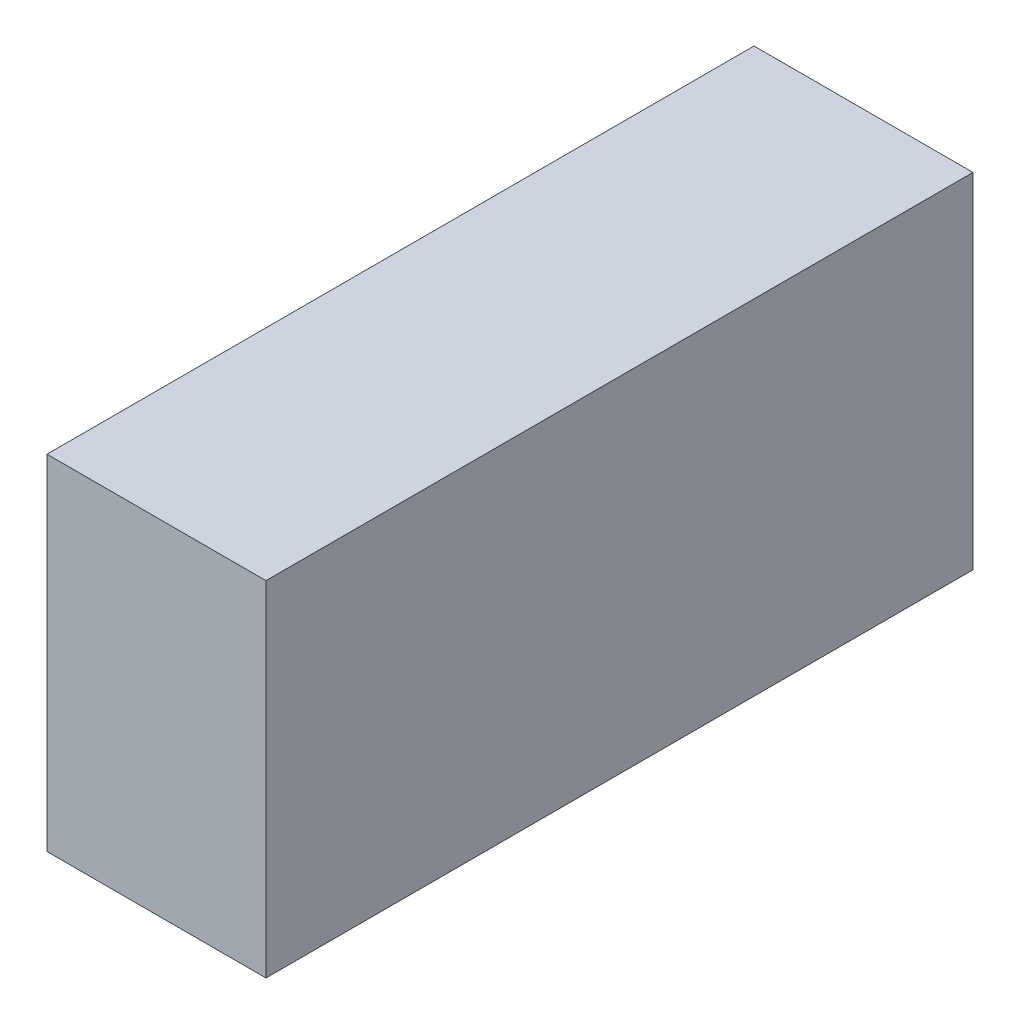
ISO-10303-21;
HEADER;
FILE_DESCRIPTION(('STEP AP214'),'2;1');
FILE_NAME('part.step','',(''),(''),'','','');
FILE_SCHEMA(('AUTOMOTIVE_DESIGN { 1 0 10303 214 1 1 1 1 }'));
ENDSEC;
DATA;
#1=APPLICATION_CONTEXT('core data for automotive mechanical design processes');
#2=APPLICATION_PROTOCOL_DEFINITION('international standard','automotive_design',2000,#1);
#3=PRODUCT_CONTEXT('',#1,'mechanical');
#4=PRODUCT('Part','Part','',(#3));
#5=PRODUCT_RELATED_PRODUCT_CATEGORY('part','',(#4));
#6=PRODUCT_DEFINITION_FORMATION('','',#4);
#7=PRODUCT_DEFINITION_CONTEXT('part definition',#1,'design');
#8=PRODUCT_DEFINITION('design','',#6,#7);
#9=PRODUCT_DEFINITION_SHAPE('','',#8);
#10=(LENGTH_UNIT() NAMED_UNIT(*) SI_UNIT(.MILLI.,.METRE.));
#11=(NAMED_UNIT(*) PLANE_ANGLE_UNIT() SI_UNIT($,.RADIAN.));
#12=(NAMED_UNIT(*) SI_UNIT($,.STERADIAN.) SOLID_ANGLE_UNIT());
#13=UNCERTAINTY_MEASURE_WITH_UNIT(LENGTH_MEASURE(1.E-05),#10,'distance_accuracy_value','');
#14=(GEOMETRIC_REPRESENTATION_CONTEXT(3) GLOBAL_UNCERTAINTY_ASSIGNED_CONTEXT((#13)) GLOBAL_UNIT_ASSIGNED_CONTEXT((#10,
#11,#12)) REPRESENTATION_CONTEXT('',''));
#15=CARTESIAN_POINT('',(0.,0.,0.));
#16=DIRECTION('',(0.,0.,1.));
#17=DIRECTION('',(1.,0.,0.));
#18=AXIS2_PLACEMENT_3D('',#15,#16,#17);
#19=CARTESIAN_POINT('',(17.5,-27.5,56.5));
#20=DIRECTION('',(-1.,0.,0.));
#21=DIRECTION('',(0.,0.,1.));
#22=AXIS2_PLACEMENT_3D('',#19,#20,#21);
#23=PLANE('',#22);
#24=DIRECTION('',(0.,1.,0.));
#25=VECTOR('',#24,1.);
#26=CARTESIAN_POINT('',(17.5,-27.5,-56.5));
#27=LINE('',#26,#25);
#28=CARTESIAN_POINT('',(17.5,-27.5,-56.5));
#29=VERTEX_POINT('',#28);
#30=CARTESIAN_POINT('',(17.5,27.5,-56.5));
#31=VERTEX_POINT('',#30);
#32=EDGE_CURVE('E113',#29,#31,#27,.T.);
#33=ORIENTED_EDGE('',*,*,#32,.T.);
#34=DIRECTION('',(0.,0.,-1.));
#35=VECTOR('',#34,1.);
#36=CARTESIAN_POINT('',(17.5,27.5,56.5));
#37=LINE('',#36,#35);
#38=CARTESIAN_POINT('',(17.5,27.5,56.5));
#39=VERTEX_POINT('',#38);
#40=EDGE_CURVE('E11',#39,#31,#37,.T.);
#41=ORIENTED_EDGE('',*,*,#40,.F.);
#42=DIRECTION('',(0.,1.,0.));
#43=VECTOR('',#42,1.);
#44=CARTESIAN_POINT('',(17.5,-27.5,56.5));
#45=LINE('',#44,#43);
#46=CARTESIAN_POINT('',(17.5,-27.5,56.5));
#47=VERTEX_POINT('',#46);
#48=EDGE_CURVE('E97',#47,#39,#45,.T.);
#49=ORIENTED_EDGE('',*,*,#48,.F.);
#50=DIRECTION('',(0.,0.,-1.));
#51=VECTOR('',#50,1.);
#52=CARTESIAN_POINT('',(17.5,-27.5,56.5));
#53=LINE('',#52,#51);
#54=EDGE_CURVE('E109',#47,#29,#53,.T.);
#55=ORIENTED_EDGE('',*,*,#54,.T.);
#56=EDGE_LOOP('',(#33,#41,#49,#55));
#57=FACE_BOUND('',#56,.T.);
#58=ADVANCED_FACE('F45',(#57),#23,.F.);
#59=CARTESIAN_POINT('',(-17.5,27.5,56.5));
#60=DIRECTION('',(0.,-1.,0.));
#61=DIRECTION('',(0.,0.,-1.));
#62=AXIS2_PLACEMENT_3D('',#59,#60,#61);
#63=PLANE('',#62);
#64=DIRECTION('',(-1.,0.,0.));
#65=VECTOR('',#64,1.);
#66=CARTESIAN_POINT('',(-17.5,27.5,-56.5));
#67=LINE('',#66,#65);
#68=CARTESIAN_POINT('',(-17.5,27.5,-56.5));
#69=VERTEX_POINT('',#68);
#70=EDGE_CURVE('E102',#31,#69,#67,.T.);
#71=ORIENTED_EDGE('',*,*,#70,.T.);
#72=DIRECTION('',(0.,0.,-1.));
#73=VECTOR('',#72,1.);
#74=CARTESIAN_POINT('',(-17.5,27.5,56.5));
#75=LINE('',#74,#73);
#76=CARTESIAN_POINT('',(-17.5,27.5,56.5));
#77=VERTEX_POINT('',#76);
#78=EDGE_CURVE('E54',#77,#69,#75,.T.);
#79=ORIENTED_EDGE('',*,*,#78,.F.);
#80=DIRECTION('',(-1.,0.,0.));
#81=VECTOR('',#80,1.);
#82=CARTESIAN_POINT('',(-17.5,27.5,56.5));
#83=LINE('',#82,#81);
#84=EDGE_CURVE('E92',#39,#77,#83,.T.);
#85=ORIENTED_EDGE('',*,*,#84,.F.);
#86=ORIENTED_EDGE('',*,*,#40,.T.);
#87=EDGE_LOOP('',(#71,#79,#85,#86));
#88=FACE_BOUND('',#87,.T.);
#89=ADVANCED_FACE('F101',(#88),#63,.F.);
#90=CARTESIAN_POINT('',(-17.5,-27.5,56.5));
#91=DIRECTION('',(1.,0.,0.));
#92=DIRECTION('',(0.,0.,-1.));
#93=AXIS2_PLACEMENT_3D('',#90,#91,#92);
#94=PLANE('',#93);
#95=DIRECTION('',(0.,-1.,0.));
#96=VECTOR('',#95,1.);
#97=CARTESIAN_POINT('',(-17.5,-27.5,-56.5));
#98=LINE('',#97,#96);
#99=CARTESIAN_POINT('',(-17.5,-27.5,-56.5));
#100=VERTEX_POINT('',#99);
#101=EDGE_CURVE('E79',#69,#100,#98,.T.);
#102=ORIENTED_EDGE('',*,*,#101,.T.);
#103=DIRECTION('',(0.,0.,-1.));
#104=VECTOR('',#103,1.);
#105=CARTESIAN_POINT('',(-17.5,-27.5,56.5));
#106=LINE('',#105,#104);
#107=CARTESIAN_POINT('',(-17.5,-27.5,56.5));
#108=VERTEX_POINT('',#107);
#109=EDGE_CURVE('E104',#108,#100,#106,.T.);
#110=ORIENTED_EDGE('',*,*,#109,.F.);
#111=DIRECTION('',(0.,-1.,0.));
#112=VECTOR('',#111,1.);
#113=CARTESIAN_POINT('',(-17.5,-27.5,56.5));
#114=LINE('',#113,#112);
#115=EDGE_CURVE('E95',#77,#108,#114,.T.);
#116=ORIENTED_EDGE('',*,*,#115,.F.);
#117=ORIENTED_EDGE('',*,*,#78,.T.);
#118=EDGE_LOOP('',(#102,#110,#116,#117));
#119=FACE_BOUND('',#118,.T.);
#120=ADVANCED_FACE('F105',(#119),#94,.F.);
#121=CARTESIAN_POINT('',(-17.5,-27.5,56.5));
#122=DIRECTION('',(0.,1.,0.));
#123=DIRECTION('',(0.,0.,1.));
#124=AXIS2_PLACEMENT_3D('',#121,#122,#123);
#125=PLANE('',#124);
#126=DIRECTION('',(1.,0.,0.));
#127=VECTOR('',#126,1.);
#128=CARTESIAN_POINT('',(-17.5,-27.5,-56.5));
#129=LINE('',#128,#127);
#130=EDGE_CURVE('E85',#100,#29,#129,.T.);
#131=ORIENTED_EDGE('',*,*,#130,.T.);
#132=ORIENTED_EDGE('',*,*,#54,.F.);
#133=DIRECTION('',(1.,0.,0.));
#134=VECTOR('',#133,1.);
#135=CARTESIAN_POINT('',(-17.5,-27.5,56.5));
#136=LINE('',#135,#134);
#137=EDGE_CURVE('E62',#108,#47,#136,.T.);
#138=ORIENTED_EDGE('',*,*,#137,.F.);
#139=ORIENTED_EDGE('',*,*,#109,.T.);
#140=EDGE_LOOP('',(#131,#132,#138,#139));
#141=FACE_BOUND('',#140,.T.);
#142=ADVANCED_FACE('F126',(#141),#125,.F.);
#143=CARTESIAN_POINT('',(0.,0.,56.5));
#144=DIRECTION('',(0.,0.,-1.));
#145=DIRECTION('',(-1.,0.,0.));
#146=AXIS2_PLACEMENT_3D('',#143,#144,#145);
#147=PLANE('',#146);
#148=ORIENTED_EDGE('',*,*,#48,.T.);
#149=ORIENTED_EDGE('',*,*,#84,.T.);
#150=ORIENTED_EDGE('',*,*,#115,.T.);
#151=ORIENTED_EDGE('',*,*,#137,.T.);
#152=EDGE_LOOP('',(#148,#149,#150,#151));
#153=FACE_BOUND('',#152,.T.);
#154=ADVANCED_FACE('F93',(#153),#147,.F.);
#155=CARTESIAN_POINT('',(0.,0.,-56.5));
#156=DIRECTION('',(0.,0.,-1.));
#157=DIRECTION('',(-1.,0.,0.));
#158=AXIS2_PLACEMENT_3D('',#155,#156,#157);
#159=PLANE('',#158);
#160=ORIENTED_EDGE('',*,*,#32,.F.);
#161=ORIENTED_EDGE('',*,*,#130,.F.);
#162=ORIENTED_EDGE('',*,*,#101,.F.);
#163=ORIENTED_EDGE('',*,*,#70,.F.);
#164=EDGE_LOOP('',(#160,#161,#162,#163));
#165=FACE_BOUND('',#164,.T.);
#166=ADVANCED_FACE('F129',(#165),#159,.T.);
#167=CLOSED_SHELL('',(#58,#89,#120,#142,#154,#166));
#168=MANIFOLD_SOLID_BREP('B2',#167);
#169=ADVANCED_BREP_SHAPE_REPRESENTATION('',(#18,#168),#14);
#170=SHAPE_DEFINITION_REPRESENTATION(#9,#169);
ENDSEC;
END-ISO-10303-21;
